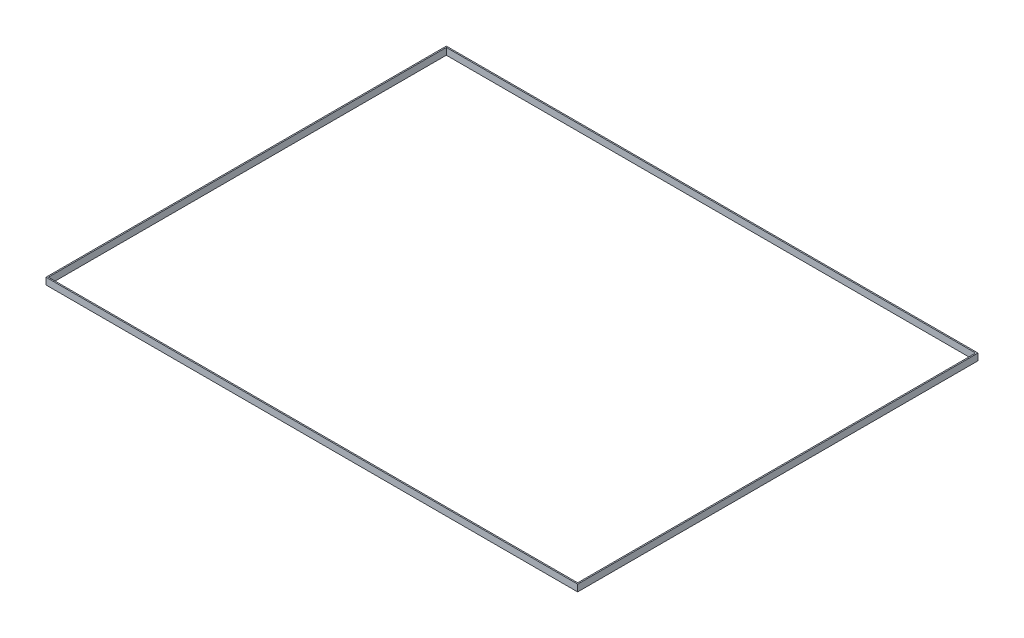
ISO-10303-21;
HEADER;
FILE_DESCRIPTION(('STEP AP214'),'2;1');
FILE_NAME('part.step','',(''),(''),'','','');
FILE_SCHEMA(('AUTOMOTIVE_DESIGN { 1 0 10303 214 1 1 1 1 }'));
ENDSEC;
DATA;
#1=APPLICATION_CONTEXT('core data for automotive mechanical design processes');
#2=APPLICATION_PROTOCOL_DEFINITION('international standard','automotive_design',2000,#1);
#3=PRODUCT_CONTEXT('',#1,'mechanical');
#4=PRODUCT('Part','Part','',(#3));
#5=PRODUCT_RELATED_PRODUCT_CATEGORY('part','',(#4));
#6=PRODUCT_DEFINITION_FORMATION('','',#4);
#7=PRODUCT_DEFINITION_CONTEXT('part definition',#1,'design');
#8=PRODUCT_DEFINITION('design','',#6,#7);
#9=PRODUCT_DEFINITION_SHAPE('','',#8);
#10=(LENGTH_UNIT() NAMED_UNIT(*) SI_UNIT(.MILLI.,.METRE.));
#11=(NAMED_UNIT(*) PLANE_ANGLE_UNIT() SI_UNIT($,.RADIAN.));
#12=(NAMED_UNIT(*) SI_UNIT($,.STERADIAN.) SOLID_ANGLE_UNIT());
#13=UNCERTAINTY_MEASURE_WITH_UNIT(LENGTH_MEASURE(1.E-05),#10,'distance_accuracy_value','');
#14=(GEOMETRIC_REPRESENTATION_CONTEXT(3) GLOBAL_UNCERTAINTY_ASSIGNED_CONTEXT((#13)) GLOBAL_UNIT_ASSIGNED_CONTEXT((#10,
#11,#12)) REPRESENTATION_CONTEXT('',''));
#15=CARTESIAN_POINT('',(0.,0.,0.));
#16=DIRECTION('',(0.,0.,1.));
#17=DIRECTION('',(1.,0.,0.));
#18=AXIS2_PLACEMENT_3D('',#15,#16,#17);
#19=CARTESIAN_POINT('',(0.,170.,0.));
#20=DIRECTION('',(0.,-1.,0.));
#21=DIRECTION('',(0.,0.,-1.));
#22=AXIS2_PLACEMENT_3D('',#19,#20,#21);
#23=PLANE('',#22);
#24=DIRECTION('',(0.,0.,1.));
#25=VECTOR('',#24,1.);
#26=CARTESIAN_POINT('',(-6680.,170.,5030.));
#27=LINE('',#26,#25);
#28=CARTESIAN_POINT('',(-6680.,170.,-5030.));
#29=VERTEX_POINT('',#28);
#30=CARTESIAN_POINT('',(-6680.,170.,5030.));
#31=VERTEX_POINT('',#30);
#32=EDGE_CURVE('E153',#29,#31,#27,.T.);
#33=ORIENTED_EDGE('',*,*,#32,.T.);
#34=DIRECTION('',(1.,0.,0.));
#35=VECTOR('',#34,1.);
#36=CARTESIAN_POINT('',(-6680.,170.,5030.));
#37=LINE('',#36,#35);
#38=CARTESIAN_POINT('',(6680.,170.,5030.));
#39=VERTEX_POINT('',#38);
#40=EDGE_CURVE('E157',#31,#39,#37,.T.);
#41=ORIENTED_EDGE('',*,*,#40,.T.);
#42=DIRECTION('',(0.,0.,-1.));
#43=VECTOR('',#42,1.);
#44=CARTESIAN_POINT('',(6680.,170.,5030.));
#45=LINE('',#44,#43);
#46=CARTESIAN_POINT('',(6680.,170.,-5030.));
#47=VERTEX_POINT('',#46);
#48=EDGE_CURVE('E161',#39,#47,#45,.T.);
#49=ORIENTED_EDGE('',*,*,#48,.T.);
#50=DIRECTION('',(-1.,0.,0.));
#51=VECTOR('',#50,1.);
#52=CARTESIAN_POINT('',(-6680.,170.,-5030.));
#53=LINE('',#52,#51);
#54=EDGE_CURVE('E164',#47,#29,#53,.T.);
#55=ORIENTED_EDGE('',*,*,#54,.T.);
#56=EDGE_LOOP('',(#33,#41,#49,#55));
#57=FACE_BOUND('',#56,.T.);
#58=DIRECTION('',(0.,0.,-1.));
#59=VECTOR('',#58,1.);
#60=CARTESIAN_POINT('',(6650.,170.,5000.));
#61=LINE('',#60,#59);
#62=CARTESIAN_POINT('',(6650.,170.,5000.));
#63=VERTEX_POINT('',#62);
#64=CARTESIAN_POINT('',(6650.,170.,-5000.));
#65=VERTEX_POINT('',#64);
#66=EDGE_CURVE('E105',#63,#65,#61,.T.);
#67=ORIENTED_EDGE('',*,*,#66,.F.);
#68=DIRECTION('',(1.,0.,0.));
#69=VECTOR('',#68,1.);
#70=CARTESIAN_POINT('',(-6650.,170.,5000.));
#71=LINE('',#70,#69);
#72=CARTESIAN_POINT('',(-6650.,170.,5000.));
#73=VERTEX_POINT('',#72);
#74=EDGE_CURVE('E131',#73,#63,#71,.T.);
#75=ORIENTED_EDGE('',*,*,#74,.F.);
#76=DIRECTION('',(0.,0.,1.));
#77=VECTOR('',#76,1.);
#78=CARTESIAN_POINT('',(-6650.,170.,5000.));
#79=LINE('',#78,#77);
#80=CARTESIAN_POINT('',(-6650.,170.,-5000.));
#81=VERTEX_POINT('',#80);
#82=EDGE_CURVE('E127',#81,#73,#79,.T.);
#83=ORIENTED_EDGE('',*,*,#82,.F.);
#84=DIRECTION('',(-1.,0.,0.));
#85=VECTOR('',#84,1.);
#86=CARTESIAN_POINT('',(-6650.,170.,-5000.));
#87=LINE('',#86,#85);
#88=EDGE_CURVE('E114',#65,#81,#87,.T.);
#89=ORIENTED_EDGE('',*,*,#88,.F.);
#90=EDGE_LOOP('',(#67,#75,#83,#89));
#91=FACE_BOUND('',#90,.T.);
#92=ADVANCED_FACE('F39',(#57,#91),#23,.F.);
#93=CARTESIAN_POINT('',(0.,0.,0.));
#94=DIRECTION('',(0.,-1.,0.));
#95=DIRECTION('',(0.,0.,-1.));
#96=AXIS2_PLACEMENT_3D('',#93,#94,#95);
#97=PLANE('',#96);
#98=DIRECTION('',(0.,0.,1.));
#99=VECTOR('',#98,1.);
#100=CARTESIAN_POINT('',(-6680.,0.,5030.));
#101=LINE('',#100,#99);
#102=CARTESIAN_POINT('',(-6680.,0.,-5030.));
#103=VERTEX_POINT('',#102);
#104=CARTESIAN_POINT('',(-6680.,0.,5030.));
#105=VERTEX_POINT('',#104);
#106=EDGE_CURVE('E123',#103,#105,#101,.T.);
#107=ORIENTED_EDGE('',*,*,#106,.F.);
#108=DIRECTION('',(-1.,0.,0.));
#109=VECTOR('',#108,1.);
#110=CARTESIAN_POINT('',(-6680.,0.,-5030.));
#111=LINE('',#110,#109);
#112=CARTESIAN_POINT('',(6680.,0.,-5030.));
#113=VERTEX_POINT('',#112);
#114=EDGE_CURVE('E158',#113,#103,#111,.T.);
#115=ORIENTED_EDGE('',*,*,#114,.F.);
#116=DIRECTION('',(0.,0.,-1.));
#117=VECTOR('',#116,1.);
#118=CARTESIAN_POINT('',(6680.,0.,5030.));
#119=LINE('',#118,#117);
#120=CARTESIAN_POINT('',(6680.,0.,5030.));
#121=VERTEX_POINT('',#120);
#122=EDGE_CURVE('E174',#121,#113,#119,.T.);
#123=ORIENTED_EDGE('',*,*,#122,.F.);
#124=DIRECTION('',(1.,0.,0.));
#125=VECTOR('',#124,1.);
#126=CARTESIAN_POINT('',(-6680.,0.,5030.));
#127=LINE('',#126,#125);
#128=EDGE_CURVE('E171',#105,#121,#127,.T.);
#129=ORIENTED_EDGE('',*,*,#128,.F.);
#130=EDGE_LOOP('',(#107,#115,#123,#129));
#131=FACE_BOUND('',#130,.T.);
#132=DIRECTION('',(1.,0.,0.));
#133=VECTOR('',#132,1.);
#134=CARTESIAN_POINT('',(-6650.,0.,5000.));
#135=LINE('',#134,#133);
#136=CARTESIAN_POINT('',(-6650.,0.,5000.));
#137=VERTEX_POINT('',#136);
#138=CARTESIAN_POINT('',(6650.,0.,5000.));
#139=VERTEX_POINT('',#138);
#140=EDGE_CURVE('E115',#137,#139,#135,.T.);
#141=ORIENTED_EDGE('',*,*,#140,.T.);
#142=DIRECTION('',(0.,0.,-1.));
#143=VECTOR('',#142,1.);
#144=CARTESIAN_POINT('',(6650.,0.,5000.));
#145=LINE('',#144,#143);
#146=CARTESIAN_POINT('',(6650.,0.,-5000.));
#147=VERTEX_POINT('',#146);
#148=EDGE_CURVE('E63',#139,#147,#145,.T.);
#149=ORIENTED_EDGE('',*,*,#148,.T.);
#150=DIRECTION('',(-1.,0.,0.));
#151=VECTOR('',#150,1.);
#152=CARTESIAN_POINT('',(-6650.,0.,-5000.));
#153=LINE('',#152,#151);
#154=CARTESIAN_POINT('',(-6650.,0.,-5000.));
#155=VERTEX_POINT('',#154);
#156=EDGE_CURVE('E121',#147,#155,#153,.T.);
#157=ORIENTED_EDGE('',*,*,#156,.T.);
#158=DIRECTION('',(0.,0.,1.));
#159=VECTOR('',#158,1.);
#160=CARTESIAN_POINT('',(-6650.,0.,5000.));
#161=LINE('',#160,#159);
#162=EDGE_CURVE('E140',#155,#137,#161,.T.);
#163=ORIENTED_EDGE('',*,*,#162,.T.);
#164=EDGE_LOOP('',(#141,#149,#157,#163));
#165=FACE_BOUND('',#164,.T.);
#166=ADVANCED_FACE('F197',(#131,#165),#97,.T.);
#167=CARTESIAN_POINT('',(-6680.,170.,5030.));
#168=DIRECTION('',(1.,0.,0.));
#169=DIRECTION('',(0.,0.,-1.));
#170=AXIS2_PLACEMENT_3D('',#167,#168,#169);
#171=PLANE('',#170);
#172=ORIENTED_EDGE('',*,*,#106,.T.);
#173=DIRECTION('',(0.,-1.,0.));
#174=VECTOR('',#173,1.);
#175=CARTESIAN_POINT('',(-6680.,170.,5030.));
#176=LINE('',#175,#174);
#177=EDGE_CURVE('E11',#31,#105,#176,.T.);
#178=ORIENTED_EDGE('',*,*,#177,.F.);
#179=ORIENTED_EDGE('',*,*,#32,.F.);
#180=DIRECTION('',(0.,-1.,0.));
#181=VECTOR('',#180,1.);
#182=CARTESIAN_POINT('',(-6680.,170.,-5030.));
#183=LINE('',#182,#181);
#184=EDGE_CURVE('E167',#29,#103,#183,.T.);
#185=ORIENTED_EDGE('',*,*,#184,.T.);
#186=EDGE_LOOP('',(#172,#178,#179,#185));
#187=FACE_BOUND('',#186,.T.);
#188=ADVANCED_FACE('F41',(#187),#171,.F.);
#189=CARTESIAN_POINT('',(-6680.,170.,5030.));
#190=DIRECTION('',(0.,0.,-1.));
#191=DIRECTION('',(-1.,0.,0.));
#192=AXIS2_PLACEMENT_3D('',#189,#190,#191);
#193=PLANE('',#192);
#194=ORIENTED_EDGE('',*,*,#128,.T.);
#195=DIRECTION('',(0.,-1.,0.));
#196=VECTOR('',#195,1.);
#197=CARTESIAN_POINT('',(6680.,170.,5030.));
#198=LINE('',#197,#196);
#199=EDGE_CURVE('E48',#39,#121,#198,.T.);
#200=ORIENTED_EDGE('',*,*,#199,.F.);
#201=ORIENTED_EDGE('',*,*,#40,.F.);
#202=ORIENTED_EDGE('',*,*,#177,.T.);
#203=EDGE_LOOP('',(#194,#200,#201,#202));
#204=FACE_BOUND('',#203,.T.);
#205=ADVANCED_FACE('F207',(#204),#193,.F.);
#206=CARTESIAN_POINT('',(6680.,170.,5030.));
#207=DIRECTION('',(-1.,0.,0.));
#208=DIRECTION('',(0.,0.,1.));
#209=AXIS2_PLACEMENT_3D('',#206,#207,#208);
#210=PLANE('',#209);
#211=ORIENTED_EDGE('',*,*,#122,.T.);
#212=DIRECTION('',(0.,-1.,0.));
#213=VECTOR('',#212,1.);
#214=CARTESIAN_POINT('',(6680.,170.,-5030.));
#215=LINE('',#214,#213);
#216=EDGE_CURVE('E182',#47,#113,#215,.T.);
#217=ORIENTED_EDGE('',*,*,#216,.F.);
#218=ORIENTED_EDGE('',*,*,#48,.F.);
#219=ORIENTED_EDGE('',*,*,#199,.T.);
#220=EDGE_LOOP('',(#211,#217,#218,#219));
#221=FACE_BOUND('',#220,.T.);
#222=ADVANCED_FACE('F191',(#221),#210,.F.);
#223=CARTESIAN_POINT('',(-6680.,170.,-5030.));
#224=DIRECTION('',(0.,0.,1.));
#225=DIRECTION('',(1.,0.,0.));
#226=AXIS2_PLACEMENT_3D('',#223,#224,#225);
#227=PLANE('',#226);
#228=ORIENTED_EDGE('',*,*,#114,.T.);
#229=ORIENTED_EDGE('',*,*,#184,.F.);
#230=ORIENTED_EDGE('',*,*,#54,.F.);
#231=ORIENTED_EDGE('',*,*,#216,.T.);
#232=EDGE_LOOP('',(#228,#229,#230,#231));
#233=FACE_BOUND('',#232,.T.);
#234=ADVANCED_FACE('F201',(#233),#227,.F.);
#235=CARTESIAN_POINT('',(6650.,170.,5000.));
#236=DIRECTION('',(-1.,0.,0.));
#237=DIRECTION('',(0.,0.,1.));
#238=AXIS2_PLACEMENT_3D('',#235,#236,#237);
#239=PLANE('',#238);
#240=ORIENTED_EDGE('',*,*,#148,.F.);
#241=DIRECTION('',(0.,-1.,0.));
#242=VECTOR('',#241,1.);
#243=CARTESIAN_POINT('',(6650.,170.,5000.));
#244=LINE('',#243,#242);
#245=EDGE_CURVE('E109',#63,#139,#244,.T.);
#246=ORIENTED_EDGE('',*,*,#245,.F.);
#247=ORIENTED_EDGE('',*,*,#66,.T.);
#248=DIRECTION('',(0.,-1.,0.));
#249=VECTOR('',#248,1.);
#250=CARTESIAN_POINT('',(6650.,170.,-5000.));
#251=LINE('',#250,#249);
#252=EDGE_CURVE('E108',#65,#147,#251,.T.);
#253=ORIENTED_EDGE('',*,*,#252,.T.);
#254=EDGE_LOOP('',(#240,#246,#247,#253));
#255=FACE_BOUND('',#254,.T.);
#256=ADVANCED_FACE('F107',(#255),#239,.T.);
#257=CARTESIAN_POINT('',(-6650.,170.,-5000.));
#258=DIRECTION('',(0.,0.,1.));
#259=DIRECTION('',(1.,0.,0.));
#260=AXIS2_PLACEMENT_3D('',#257,#258,#259);
#261=PLANE('',#260);
#262=ORIENTED_EDGE('',*,*,#156,.F.);
#263=ORIENTED_EDGE('',*,*,#252,.F.);
#264=ORIENTED_EDGE('',*,*,#88,.T.);
#265=DIRECTION('',(0.,-1.,0.));
#266=VECTOR('',#265,1.);
#267=CARTESIAN_POINT('',(-6650.,170.,-5000.));
#268=LINE('',#267,#266);
#269=EDGE_CURVE('E124',#81,#155,#268,.T.);
#270=ORIENTED_EDGE('',*,*,#269,.T.);
#271=EDGE_LOOP('',(#262,#263,#264,#270));
#272=FACE_BOUND('',#271,.T.);
#273=ADVANCED_FACE('F118',(#272),#261,.T.);
#274=CARTESIAN_POINT('',(-6650.,170.,5000.));
#275=DIRECTION('',(1.,0.,0.));
#276=DIRECTION('',(0.,0.,-1.));
#277=AXIS2_PLACEMENT_3D('',#274,#275,#276);
#278=PLANE('',#277);
#279=ORIENTED_EDGE('',*,*,#162,.F.);
#280=ORIENTED_EDGE('',*,*,#269,.F.);
#281=ORIENTED_EDGE('',*,*,#82,.T.);
#282=DIRECTION('',(0.,-1.,0.));
#283=VECTOR('',#282,1.);
#284=CARTESIAN_POINT('',(-6650.,170.,5000.));
#285=LINE('',#284,#283);
#286=EDGE_CURVE('E55',#73,#137,#285,.T.);
#287=ORIENTED_EDGE('',*,*,#286,.T.);
#288=EDGE_LOOP('',(#279,#280,#281,#287));
#289=FACE_BOUND('',#288,.T.);
#290=ADVANCED_FACE('F230',(#289),#278,.T.);
#291=CARTESIAN_POINT('',(-6650.,170.,5000.));
#292=DIRECTION('',(0.,0.,-1.));
#293=DIRECTION('',(-1.,0.,0.));
#294=AXIS2_PLACEMENT_3D('',#291,#292,#293);
#295=PLANE('',#294);
#296=ORIENTED_EDGE('',*,*,#140,.F.);
#297=ORIENTED_EDGE('',*,*,#286,.F.);
#298=ORIENTED_EDGE('',*,*,#74,.T.);
#299=ORIENTED_EDGE('',*,*,#245,.T.);
#300=EDGE_LOOP('',(#296,#297,#298,#299));
#301=FACE_BOUND('',#300,.T.);
#302=ADVANCED_FACE('F234',(#301),#295,.T.);
#303=CLOSED_SHELL('',(#92,#166,#188,#205,#222,#234,#256,#273,#290,#302));
#304=MANIFOLD_SOLID_BREP('B2',#303);
#305=ADVANCED_BREP_SHAPE_REPRESENTATION('',(#18,#304),#14);
#306=SHAPE_DEFINITION_REPRESENTATION(#9,#305);
ENDSEC;
END-ISO-10303-21;
